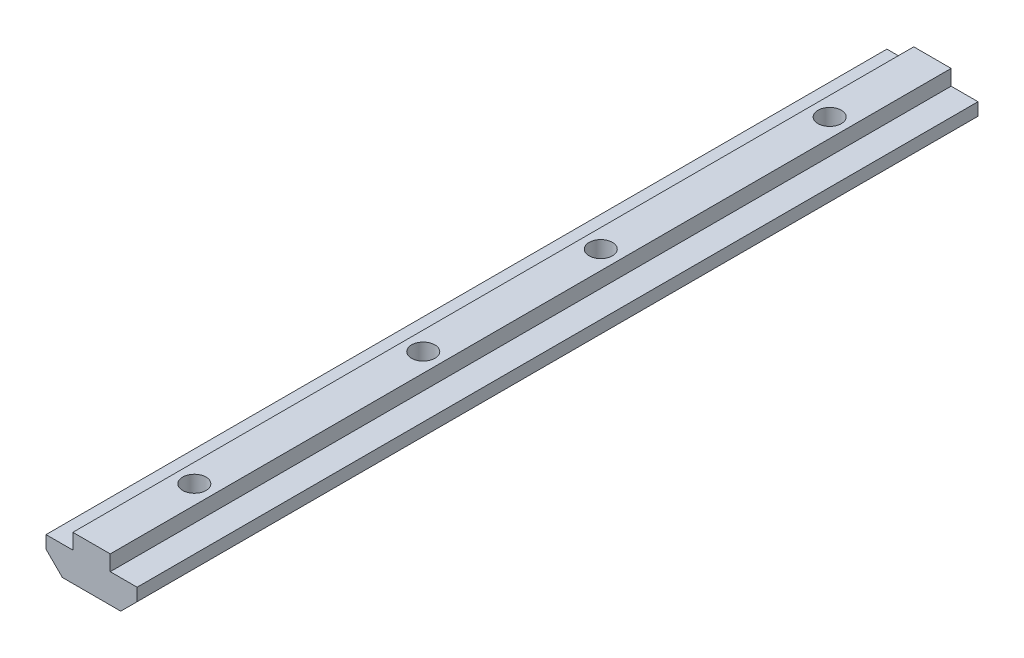
ISO-10303-21;
HEADER;
FILE_DESCRIPTION(('STEP AP214'),'2;1');
FILE_NAME('part.step','',(''),(''),'','','');
FILE_SCHEMA(('AUTOMOTIVE_DESIGN { 1 0 10303 214 1 1 1 1 }'));
ENDSEC;
DATA;
#1=APPLICATION_CONTEXT('core data for automotive mechanical design processes');
#2=APPLICATION_PROTOCOL_DEFINITION('international standard','automotive_design',2000,#1);
#3=PRODUCT_CONTEXT('',#1,'mechanical');
#4=PRODUCT('Part','Part','',(#3));
#5=PRODUCT_RELATED_PRODUCT_CATEGORY('part','',(#4));
#6=PRODUCT_DEFINITION_FORMATION('','',#4);
#7=PRODUCT_DEFINITION_CONTEXT('part definition',#1,'design');
#8=PRODUCT_DEFINITION('design','',#6,#7);
#9=PRODUCT_DEFINITION_SHAPE('','',#8);
#10=(LENGTH_UNIT() NAMED_UNIT(*) SI_UNIT(.MILLI.,.METRE.));
#11=(NAMED_UNIT(*) PLANE_ANGLE_UNIT() SI_UNIT($,.RADIAN.));
#12=(NAMED_UNIT(*) SI_UNIT($,.STERADIAN.) SOLID_ANGLE_UNIT());
#13=UNCERTAINTY_MEASURE_WITH_UNIT(LENGTH_MEASURE(1.E-05),#10,'distance_accuracy_value','');
#14=(GEOMETRIC_REPRESENTATION_CONTEXT(3) GLOBAL_UNCERTAINTY_ASSIGNED_CONTEXT((#13)) GLOBAL_UNIT_ASSIGNED_CONTEXT((#10,
#11,#12)) REPRESENTATION_CONTEXT('',''));
#15=CARTESIAN_POINT('',(0.,0.,0.));
#16=DIRECTION('',(0.,0.,1.));
#17=DIRECTION('',(1.,0.,0.));
#18=AXIS2_PLACEMENT_3D('',#15,#16,#17);
#19=CARTESIAN_POINT('',(12.5000000000002,-4.54497550705923E-13,180.));
#20=DIRECTION('',(-0.707106781186547,0.707106781186547,0.));
#21=DIRECTION('',(-0.707106781186548,-0.707106781186548,0.));
#22=AXIS2_PLACEMENT_3D('',#19,#20,#21);
#23=PLANE('',#22);
#24=DIRECTION('',(0.707106781186548,0.707106781186548,0.));
#25=VECTOR('',#24,1.);
#26=CARTESIAN_POINT('',(12.5000000000002,-4.54497550705923E-13,0.));
#27=LINE('',#26,#25);
#28=CARTESIAN_POINT('',(12.5000000000002,-4.54497550705923E-13,0.));
#29=VERTEX_POINT('',#28);
#30=CARTESIAN_POINT('',(16.0000000000005,3.49999999999977,0.));
#31=VERTEX_POINT('',#30);
#32=EDGE_CURVE('E147',#29,#31,#27,.T.);
#33=ORIENTED_EDGE('',*,*,#32,.T.);
#34=DIRECTION('',(0.,0.,-1.));
#35=VECTOR('',#34,1.);
#36=CARTESIAN_POINT('',(16.0000000000005,3.49999999999977,180.));
#37=LINE('',#36,#35);
#38=CARTESIAN_POINT('',(16.0000000000005,3.49999999999977,180.));
#39=VERTEX_POINT('',#38);
#40=EDGE_CURVE('E11',#39,#31,#37,.T.);
#41=ORIENTED_EDGE('',*,*,#40,.F.);
#42=DIRECTION('',(0.707106781186548,0.707106781186548,0.));
#43=VECTOR('',#42,1.);
#44=CARTESIAN_POINT('',(12.5000000000002,-4.54497550705923E-13,180.));
#45=LINE('',#44,#43);
#46=CARTESIAN_POINT('',(12.5000000000002,-4.54497550705923E-13,180.));
#47=VERTEX_POINT('',#46);
#48=EDGE_CURVE('E166',#47,#39,#45,.T.);
#49=ORIENTED_EDGE('',*,*,#48,.F.);
#50=DIRECTION('',(0.,0.,-1.));
#51=VECTOR('',#50,1.);
#52=CARTESIAN_POINT('',(12.5000000000002,-4.54497550705923E-13,180.));
#53=LINE('',#52,#51);
#54=EDGE_CURVE('E143',#47,#29,#53,.T.);
#55=ORIENTED_EDGE('',*,*,#54,.T.);
#56=EDGE_LOOP('',(#33,#41,#49,#55));
#57=FACE_BOUND('',#56,.T.);
#58=ADVANCED_FACE('F37',(#57),#23,.F.);
#59=CARTESIAN_POINT('',(16.0000000000005,3.49999999999977,180.));
#60=DIRECTION('',(-1.,0.,0.));
#61=DIRECTION('',(0.,-1.,0.));
#62=AXIS2_PLACEMENT_3D('',#59,#60,#61);
#63=PLANE('',#62);
#64=DIRECTION('',(0.,1.,0.));
#65=VECTOR('',#64,1.);
#66=CARTESIAN_POINT('',(16.0000000000005,3.49999999999977,0.));
#67=LINE('',#66,#65);
#68=CARTESIAN_POINT('',(16.0000000000002,6.19999999999982,0.));
#69=VERTEX_POINT('',#68);
#70=EDGE_CURVE('E150',#31,#69,#67,.T.);
#71=ORIENTED_EDGE('',*,*,#70,.T.);
#72=DIRECTION('',(0.,0.,-1.));
#73=VECTOR('',#72,1.);
#74=CARTESIAN_POINT('',(16.0000000000002,6.19999999999982,180.));
#75=LINE('',#74,#73);
#76=CARTESIAN_POINT('',(16.0000000000002,6.19999999999982,180.));
#77=VERTEX_POINT('',#76);
#78=EDGE_CURVE('E46',#77,#69,#75,.T.);
#79=ORIENTED_EDGE('',*,*,#78,.F.);
#80=DIRECTION('',(0.,1.,0.));
#81=VECTOR('',#80,1.);
#82=CARTESIAN_POINT('',(16.0000000000005,3.49999999999977,180.));
#83=LINE('',#82,#81);
#84=EDGE_CURVE('E104',#39,#77,#83,.T.);
#85=ORIENTED_EDGE('',*,*,#84,.F.);
#86=ORIENTED_EDGE('',*,*,#40,.T.);
#87=EDGE_LOOP('',(#71,#79,#85,#86));
#88=FACE_BOUND('',#87,.T.);
#89=ADVANCED_FACE('F242',(#88),#63,.F.);
#90=CARTESIAN_POINT('',(16.0000000000002,6.19999999999982,180.));
#91=DIRECTION('',(0.,-1.,0.));
#92=DIRECTION('',(1.,0.,0.));
#93=AXIS2_PLACEMENT_3D('',#90,#91,#92);
#94=PLANE('',#93);
#95=DIRECTION('',(-1.,0.,0.));
#96=VECTOR('',#95,1.);
#97=CARTESIAN_POINT('',(16.0000000000002,6.19999999999982,0.));
#98=LINE('',#97,#96);
#99=CARTESIAN_POINT('',(10.2500000000002,6.20000000000005,0.));
#100=VERTEX_POINT('',#99);
#101=EDGE_CURVE('E153',#69,#100,#98,.T.);
#102=ORIENTED_EDGE('',*,*,#101,.T.);
#103=DIRECTION('',(0.,0.,-1.));
#104=VECTOR('',#103,1.);
#105=CARTESIAN_POINT('',(10.2500000000002,6.20000000000005,180.));
#106=LINE('',#105,#104);
#107=CARTESIAN_POINT('',(10.2500000000002,6.20000000000005,180.));
#108=VERTEX_POINT('',#107);
#109=EDGE_CURVE('E179',#108,#100,#106,.T.);
#110=ORIENTED_EDGE('',*,*,#109,.F.);
#111=DIRECTION('',(-1.,0.,0.));
#112=VECTOR('',#111,1.);
#113=CARTESIAN_POINT('',(16.0000000000002,6.19999999999982,180.));
#114=LINE('',#113,#112);
#115=EDGE_CURVE('E204',#77,#108,#114,.T.);
#116=ORIENTED_EDGE('',*,*,#115,.F.);
#117=ORIENTED_EDGE('',*,*,#78,.T.);
#118=EDGE_LOOP('',(#102,#110,#116,#117));
#119=FACE_BOUND('',#118,.T.);
#120=ADVANCED_FACE('F246',(#119),#94,.F.);
#121=CARTESIAN_POINT('',(10.2500000000002,9.49999999999977,180.));
#122=DIRECTION('',(-1.,0.,0.));
#123=DIRECTION('',(0.,0.,1.));
#124=AXIS2_PLACEMENT_3D('',#121,#122,#123);
#125=PLANE('',#124);
#126=DIRECTION('',(0.,1.,0.));
#127=VECTOR('',#126,1.);
#128=CARTESIAN_POINT('',(10.2500000000002,9.49999999999977,0.));
#129=LINE('',#128,#127);
#130=CARTESIAN_POINT('',(10.2500000000002,9.49999999999977,0.));
#131=VERTEX_POINT('',#130);
#132=EDGE_CURVE('E155',#100,#131,#129,.T.);
#133=ORIENTED_EDGE('',*,*,#132,.T.);
#134=DIRECTION('',(0.,0.,-1.));
#135=VECTOR('',#134,1.);
#136=CARTESIAN_POINT('',(10.2500000000002,9.49999999999977,180.));
#137=LINE('',#136,#135);
#138=CARTESIAN_POINT('',(10.2500000000002,9.49999999999977,180.));
#139=VERTEX_POINT('',#138);
#140=EDGE_CURVE('E176',#139,#131,#137,.T.);
#141=ORIENTED_EDGE('',*,*,#140,.F.);
#142=DIRECTION('',(0.,1.,0.));
#143=VECTOR('',#142,1.);
#144=CARTESIAN_POINT('',(10.2500000000002,9.49999999999977,180.));
#145=LINE('',#144,#143);
#146=EDGE_CURVE('E206',#108,#139,#145,.T.);
#147=ORIENTED_EDGE('',*,*,#146,.F.);
#148=ORIENTED_EDGE('',*,*,#109,.T.);
#149=EDGE_LOOP('',(#133,#141,#147,#148));
#150=FACE_BOUND('',#149,.T.);
#151=ADVANCED_FACE('F250',(#150),#125,.F.);
#152=CARTESIAN_POINT('',(2.25000000000023,9.49999999999977,180.));
#153=DIRECTION('',(0.,-1.,0.));
#154=DIRECTION('',(0.,0.,-1.));
#155=AXIS2_PLACEMENT_3D('',#152,#153,#154);
#156=PLANE('',#155);
#157=CARTESIAN_POINT('',(6.25000000000023,9.49999999999977,158.));
#158=DIRECTION('',(0.,1.,0.));
#159=DIRECTION('',(0.,0.,1.));
#160=AXIS2_PLACEMENT_3D('',#157,#158,#159);
#161=CIRCLE('',#160,2.5);
#162=CARTESIAN_POINT('',(6.25000000000023,9.49999999999977,160.5));
#163=VERTEX_POINT('',#162);
#164=EDGE_CURVE('E353',#163,#163,#161,.T.);
#165=ORIENTED_EDGE('',*,*,#164,.F.);
#166=EDGE_LOOP('',(#165));
#167=FACE_BOUND('',#166,.T.);
#168=CARTESIAN_POINT('',(6.25000000000023,9.49999999999977,109.));
#169=DIRECTION('',(0.,1.,0.));
#170=DIRECTION('',(0.,0.,1.));
#171=AXIS2_PLACEMENT_3D('',#168,#169,#170);
#172=CIRCLE('',#171,2.5);
#173=CARTESIAN_POINT('',(6.25000000000023,9.49999999999977,111.5));
#174=VERTEX_POINT('',#173);
#175=EDGE_CURVE('E196',#174,#174,#172,.T.);
#176=ORIENTED_EDGE('',*,*,#175,.F.);
#177=EDGE_LOOP('',(#176));
#178=FACE_BOUND('',#177,.T.);
#179=CARTESIAN_POINT('',(6.25000000000023,9.49999999999977,22.));
#180=DIRECTION('',(0.,1.,0.));
#181=DIRECTION('',(0.,0.,1.));
#182=AXIS2_PLACEMENT_3D('',#179,#180,#181);
#183=CIRCLE('',#182,2.5);
#184=CARTESIAN_POINT('',(6.25000000000023,9.49999999999977,24.5));
#185=VERTEX_POINT('',#184);
#186=EDGE_CURVE('E186',#185,#185,#183,.T.);
#187=ORIENTED_EDGE('',*,*,#186,.F.);
#188=EDGE_LOOP('',(#187));
#189=FACE_BOUND('',#188,.T.);
#190=CARTESIAN_POINT('',(6.25000000000023,9.49999999999977,71.));
#191=DIRECTION('',(0.,1.,0.));
#192=DIRECTION('',(0.,0.,1.));
#193=AXIS2_PLACEMENT_3D('',#190,#191,#192);
#194=CIRCLE('',#193,2.5);
#195=CARTESIAN_POINT('',(6.25000000000023,9.49999999999977,73.5));
#196=VERTEX_POINT('',#195);
#197=EDGE_CURVE('E185',#196,#196,#194,.T.);
#198=ORIENTED_EDGE('',*,*,#197,.F.);
#199=EDGE_LOOP('',(#198));
#200=FACE_BOUND('',#199,.T.);
#201=DIRECTION('',(-1.,0.,0.));
#202=VECTOR('',#201,1.);
#203=CARTESIAN_POINT('',(2.25000000000023,9.49999999999977,0.));
#204=LINE('',#203,#202);
#205=CARTESIAN_POINT('',(2.25000000000023,9.49999999999977,0.));
#206=VERTEX_POINT('',#205);
#207=EDGE_CURVE('E157',#131,#206,#204,.T.);
#208=ORIENTED_EDGE('',*,*,#207,.T.);
#209=DIRECTION('',(0.,0.,-1.));
#210=VECTOR('',#209,1.);
#211=CARTESIAN_POINT('',(2.25000000000023,9.49999999999977,180.));
#212=LINE('',#211,#210);
#213=CARTESIAN_POINT('',(2.25000000000023,9.49999999999977,180.));
#214=VERTEX_POINT('',#213);
#215=EDGE_CURVE('E173',#214,#206,#212,.T.);
#216=ORIENTED_EDGE('',*,*,#215,.F.);
#217=DIRECTION('',(-1.,0.,0.));
#218=VECTOR('',#217,1.);
#219=CARTESIAN_POINT('',(2.25000000000023,9.49999999999977,180.));
#220=LINE('',#219,#218);
#221=EDGE_CURVE('E208',#139,#214,#220,.T.);
#222=ORIENTED_EDGE('',*,*,#221,.F.);
#223=ORIENTED_EDGE('',*,*,#140,.T.);
#224=EDGE_LOOP('',(#208,#216,#222,#223));
#225=FACE_BOUND('',#224,.T.);
#226=ADVANCED_FACE('F256',(#167,#178,#189,#200,#225),#156,.F.);
#227=CARTESIAN_POINT('',(2.25000000000023,9.49999999999977,180.));
#228=DIRECTION('',(1.,0.,0.));
#229=DIRECTION('',(0.,0.,-1.));
#230=AXIS2_PLACEMENT_3D('',#227,#228,#229);
#231=PLANE('',#230);
#232=DIRECTION('',(0.,-1.,0.));
#233=VECTOR('',#232,1.);
#234=CARTESIAN_POINT('',(2.25000000000023,9.49999999999977,0.));
#235=LINE('',#234,#233);
#236=CARTESIAN_POINT('',(2.25000000000023,6.20000000000005,0.));
#237=VERTEX_POINT('',#236);
#238=EDGE_CURVE('E159',#206,#237,#235,.T.);
#239=ORIENTED_EDGE('',*,*,#238,.T.);
#240=DIRECTION('',(0.,0.,-1.));
#241=VECTOR('',#240,1.);
#242=CARTESIAN_POINT('',(2.25000000000023,6.20000000000005,180.));
#243=LINE('',#242,#241);
#244=CARTESIAN_POINT('',(2.25000000000023,6.20000000000005,180.));
#245=VERTEX_POINT('',#244);
#246=EDGE_CURVE('E170',#245,#237,#243,.T.);
#247=ORIENTED_EDGE('',*,*,#246,.F.);
#248=DIRECTION('',(0.,-1.,0.));
#249=VECTOR('',#248,1.);
#250=CARTESIAN_POINT('',(2.25000000000023,9.49999999999977,180.));
#251=LINE('',#250,#249);
#252=EDGE_CURVE('E210',#214,#245,#251,.T.);
#253=ORIENTED_EDGE('',*,*,#252,.F.);
#254=ORIENTED_EDGE('',*,*,#215,.T.);
#255=EDGE_LOOP('',(#239,#247,#253,#254));
#256=FACE_BOUND('',#255,.T.);
#257=ADVANCED_FACE('F216',(#256),#231,.F.);
#258=CARTESIAN_POINT('',(2.25000000000023,6.20000000000005,180.));
#259=DIRECTION('',(0.,-1.,0.));
#260=DIRECTION('',(1.,0.,0.));
#261=AXIS2_PLACEMENT_3D('',#258,#259,#260);
#262=PLANE('',#261);
#263=DIRECTION('',(-1.,0.,0.));
#264=VECTOR('',#263,1.);
#265=CARTESIAN_POINT('',(2.25000000000023,6.20000000000005,0.));
#266=LINE('',#265,#264);
#267=CARTESIAN_POINT('',(-3.49999999999977,6.19999999999982,0.));
#268=VERTEX_POINT('',#267);
#269=EDGE_CURVE('E161',#237,#268,#266,.T.);
#270=ORIENTED_EDGE('',*,*,#269,.T.);
#271=DIRECTION('',(0.,0.,-1.));
#272=VECTOR('',#271,1.);
#273=CARTESIAN_POINT('',(-3.49999999999977,6.19999999999982,180.));
#274=LINE('',#273,#272);
#275=CARTESIAN_POINT('',(-3.49999999999977,6.19999999999982,180.));
#276=VERTEX_POINT('',#275);
#277=EDGE_CURVE('E138',#276,#268,#274,.T.);
#278=ORIENTED_EDGE('',*,*,#277,.F.);
#279=DIRECTION('',(-1.,0.,0.));
#280=VECTOR('',#279,1.);
#281=CARTESIAN_POINT('',(2.25000000000023,6.20000000000005,180.));
#282=LINE('',#281,#280);
#283=EDGE_CURVE('E129',#245,#276,#282,.T.);
#284=ORIENTED_EDGE('',*,*,#283,.F.);
#285=ORIENTED_EDGE('',*,*,#246,.T.);
#286=EDGE_LOOP('',(#270,#278,#284,#285));
#287=FACE_BOUND('',#286,.T.);
#288=ADVANCED_FACE('F220',(#287),#262,.F.);
#289=CARTESIAN_POINT('',(-3.49999999999977,6.19999999999982,180.));
#290=DIRECTION('',(1.,0.,0.));
#291=DIRECTION('',(0.,1.,0.));
#292=AXIS2_PLACEMENT_3D('',#289,#290,#291);
#293=PLANE('',#292);
#294=DIRECTION('',(0.,-1.,0.));
#295=VECTOR('',#294,1.);
#296=CARTESIAN_POINT('',(-3.49999999999977,6.19999999999982,0.));
#297=LINE('',#296,#295);
#298=CARTESIAN_POINT('',(-3.49999999999954,3.49999999999955,0.));
#299=VERTEX_POINT('',#298);
#300=EDGE_CURVE('E137',#268,#299,#297,.T.);
#301=ORIENTED_EDGE('',*,*,#300,.T.);
#302=DIRECTION('',(0.,0.,-1.));
#303=VECTOR('',#302,1.);
#304=CARTESIAN_POINT('',(-3.49999999999954,3.49999999999955,180.));
#305=LINE('',#304,#303);
#306=CARTESIAN_POINT('',(-3.49999999999954,3.49999999999955,180.));
#307=VERTEX_POINT('',#306);
#308=EDGE_CURVE('E134',#307,#299,#305,.T.);
#309=ORIENTED_EDGE('',*,*,#308,.F.);
#310=DIRECTION('',(0.,-1.,0.));
#311=VECTOR('',#310,1.);
#312=CARTESIAN_POINT('',(-3.49999999999977,6.19999999999982,180.));
#313=LINE('',#312,#311);
#314=EDGE_CURVE('E123',#276,#307,#313,.T.);
#315=ORIENTED_EDGE('',*,*,#314,.F.);
#316=ORIENTED_EDGE('',*,*,#277,.T.);
#317=EDGE_LOOP('',(#301,#309,#315,#316));
#318=FACE_BOUND('',#317,.T.);
#319=ADVANCED_FACE('F135',(#318),#293,.F.);
#320=CARTESIAN_POINT('',(0.,0.,180.));
#321=DIRECTION('',(0.707106781186547,0.707106781186547,0.));
#322=DIRECTION('',(-0.707106781186548,0.707106781186548,0.));
#323=AXIS2_PLACEMENT_3D('',#320,#321,#322);
#324=PLANE('',#323);
#325=DIRECTION('',(0.707106781186547,-0.707106781186547,0.));
#326=VECTOR('',#325,1.);
#327=CARTESIAN_POINT('',(0.,0.,0.));
#328=LINE('',#327,#326);
#329=CARTESIAN_POINT('',(0.,0.,0.));
#330=VERTEX_POINT('',#329);
#331=EDGE_CURVE('E90',#299,#330,#328,.T.);
#332=ORIENTED_EDGE('',*,*,#331,.T.);
#333=DIRECTION('',(0.,0.,-1.));
#334=VECTOR('',#333,1.);
#335=CARTESIAN_POINT('',(0.,0.,180.));
#336=LINE('',#335,#334);
#337=CARTESIAN_POINT('',(0.,0.,180.));
#338=VERTEX_POINT('',#337);
#339=EDGE_CURVE('E139',#338,#330,#336,.T.);
#340=ORIENTED_EDGE('',*,*,#339,.F.);
#341=DIRECTION('',(0.707106781186547,-0.707106781186547,0.));
#342=VECTOR('',#341,1.);
#343=CARTESIAN_POINT('',(0.,0.,180.));
#344=LINE('',#343,#342);
#345=EDGE_CURVE('E127',#307,#338,#344,.T.);
#346=ORIENTED_EDGE('',*,*,#345,.F.);
#347=ORIENTED_EDGE('',*,*,#308,.T.);
#348=EDGE_LOOP('',(#332,#340,#346,#347));
#349=FACE_BOUND('',#348,.T.);
#350=ADVANCED_FACE('F141',(#349),#324,.F.);
#351=CARTESIAN_POINT('',(12.5000000000002,-4.54497550705923E-13,180.));
#352=DIRECTION('',(0.,1.,0.));
#353=DIRECTION('',(-1.,0.,0.));
#354=AXIS2_PLACEMENT_3D('',#351,#352,#353);
#355=PLANE('',#354);
#356=CARTESIAN_POINT('',(6.25000000000023,-2.27248775352962E-13,158.));
#357=DIRECTION('',(0.,1.,0.));
#358=DIRECTION('',(-1.,0.,0.));
#359=AXIS2_PLACEMENT_3D('',#356,#357,#358);
#360=CIRCLE('',#359,2.5);
#361=CARTESIAN_POINT('',(3.75000000000023,-1.36349265211779E-13,158.));
#362=VERTEX_POINT('',#361);
#363=EDGE_CURVE('E355',#362,#362,#360,.T.);
#364=ORIENTED_EDGE('',*,*,#363,.T.);
#365=EDGE_LOOP('',(#364));
#366=FACE_BOUND('',#365,.T.);
#367=CARTESIAN_POINT('',(6.25000000000023,-2.27248775352962E-13,109.));
#368=DIRECTION('',(0.,1.,0.));
#369=DIRECTION('',(-1.,0.,0.));
#370=AXIS2_PLACEMENT_3D('',#367,#368,#369);
#371=CIRCLE('',#370,2.5);
#372=CARTESIAN_POINT('',(3.75000000000023,-1.36349265211779E-13,109.));
#373=VERTEX_POINT('',#372);
#374=EDGE_CURVE('E40',#373,#373,#371,.T.);
#375=ORIENTED_EDGE('',*,*,#374,.T.);
#376=EDGE_LOOP('',(#375));
#377=FACE_BOUND('',#376,.T.);
#378=CARTESIAN_POINT('',(6.25000000000023,-2.27248775352962E-13,22.));
#379=DIRECTION('',(0.,1.,0.));
#380=DIRECTION('',(-1.,0.,0.));
#381=AXIS2_PLACEMENT_3D('',#378,#379,#380);
#382=CIRCLE('',#381,2.5);
#383=CARTESIAN_POINT('',(3.75000000000023,-1.36349265211779E-13,22.));
#384=VERTEX_POINT('',#383);
#385=EDGE_CURVE('E183',#384,#384,#382,.T.);
#386=ORIENTED_EDGE('',*,*,#385,.T.);
#387=EDGE_LOOP('',(#386));
#388=FACE_BOUND('',#387,.T.);
#389=CARTESIAN_POINT('',(6.25000000000023,-2.27248775352962E-13,71.));
#390=DIRECTION('',(0.,1.,0.));
#391=DIRECTION('',(-1.,0.,0.));
#392=AXIS2_PLACEMENT_3D('',#389,#390,#391);
#393=CIRCLE('',#392,2.5);
#394=CARTESIAN_POINT('',(3.75000000000023,-1.36349265211779E-13,71.));
#395=VERTEX_POINT('',#394);
#396=EDGE_CURVE('E151',#395,#395,#393,.T.);
#397=ORIENTED_EDGE('',*,*,#396,.T.);
#398=EDGE_LOOP('',(#397));
#399=FACE_BOUND('',#398,.T.);
#400=DIRECTION('',(1.,0.,0.));
#401=VECTOR('',#400,1.);
#402=CARTESIAN_POINT('',(12.5000000000002,-4.54497550705923E-13,0.));
#403=LINE('',#402,#401);
#404=EDGE_CURVE('E96',#330,#29,#403,.T.);
#405=ORIENTED_EDGE('',*,*,#404,.T.);
#406=ORIENTED_EDGE('',*,*,#54,.F.);
#407=DIRECTION('',(1.,0.,0.));
#408=VECTOR('',#407,1.);
#409=CARTESIAN_POINT('',(12.5000000000002,-4.54497550705923E-13,180.));
#410=LINE('',#409,#408);
#411=EDGE_CURVE('E55',#338,#47,#410,.T.);
#412=ORIENTED_EDGE('',*,*,#411,.F.);
#413=ORIENTED_EDGE('',*,*,#339,.T.);
#414=EDGE_LOOP('',(#405,#406,#412,#413));
#415=FACE_BOUND('',#414,.T.);
#416=ADVANCED_FACE('F228',(#366,#377,#388,#399,#415),#355,.F.);
#417=CARTESIAN_POINT('',(0.,0.,180.));
#418=DIRECTION('',(0.,0.,1.));
#419=DIRECTION('',(1.,0.,0.));
#420=AXIS2_PLACEMENT_3D('',#417,#418,#419);
#421=PLANE('',#420);
#422=ORIENTED_EDGE('',*,*,#48,.T.);
#423=ORIENTED_EDGE('',*,*,#84,.T.);
#424=ORIENTED_EDGE('',*,*,#115,.T.);
#425=ORIENTED_EDGE('',*,*,#146,.T.);
#426=ORIENTED_EDGE('',*,*,#221,.T.);
#427=ORIENTED_EDGE('',*,*,#252,.T.);
#428=ORIENTED_EDGE('',*,*,#283,.T.);
#429=ORIENTED_EDGE('',*,*,#314,.T.);
#430=ORIENTED_EDGE('',*,*,#345,.T.);
#431=ORIENTED_EDGE('',*,*,#411,.T.);
#432=EDGE_LOOP('',(#422,#423,#424,#425,#426,#427,#428,#429,#430,#431));
#433=FACE_BOUND('',#432,.T.);
#434=ADVANCED_FACE('F125',(#433),#421,.T.);
#435=CARTESIAN_POINT('',(0.,0.,0.));
#436=DIRECTION('',(0.,0.,1.));
#437=DIRECTION('',(1.,0.,0.));
#438=AXIS2_PLACEMENT_3D('',#435,#436,#437);
#439=PLANE('',#438);
#440=ORIENTED_EDGE('',*,*,#32,.F.);
#441=ORIENTED_EDGE('',*,*,#404,.F.);
#442=ORIENTED_EDGE('',*,*,#331,.F.);
#443=ORIENTED_EDGE('',*,*,#300,.F.);
#444=ORIENTED_EDGE('',*,*,#269,.F.);
#445=ORIENTED_EDGE('',*,*,#238,.F.);
#446=ORIENTED_EDGE('',*,*,#207,.F.);
#447=ORIENTED_EDGE('',*,*,#132,.F.);
#448=ORIENTED_EDGE('',*,*,#101,.F.);
#449=ORIENTED_EDGE('',*,*,#70,.F.);
#450=EDGE_LOOP('',(#440,#441,#442,#443,#444,#445,#446,#447,#448,#449));
#451=FACE_BOUND('',#450,.T.);
#452=ADVANCED_FACE('F223',(#451),#439,.F.);
#453=CARTESIAN_POINT('',(6.25000000000023,9.49999999999977,71.));
#454=DIRECTION('',(0.,1.,0.));
#455=DIRECTION('',(0.,0.,1.));
#456=AXIS2_PLACEMENT_3D('',#453,#454,#455);
#457=CYLINDRICAL_SURFACE('',#456,2.5);
#458=ORIENTED_EDGE('',*,*,#197,.T.);
#459=EDGE_LOOP('',(#458));
#460=FACE_BOUND('',#459,.T.);
#461=ORIENTED_EDGE('',*,*,#396,.F.);
#462=EDGE_LOOP('',(#461));
#463=FACE_BOUND('',#462,.T.);
#464=ADVANCED_FACE('F290',(#460,#463),#457,.F.);
#465=CARTESIAN_POINT('',(6.25000000000023,9.49999999999977,22.));
#466=DIRECTION('',(0.,1.,0.));
#467=DIRECTION('',(0.,0.,1.));
#468=AXIS2_PLACEMENT_3D('',#465,#466,#467);
#469=CYLINDRICAL_SURFACE('',#468,2.5);
#470=ORIENTED_EDGE('',*,*,#186,.T.);
#471=EDGE_LOOP('',(#470));
#472=FACE_BOUND('',#471,.T.);
#473=ORIENTED_EDGE('',*,*,#385,.F.);
#474=EDGE_LOOP('',(#473));
#475=FACE_BOUND('',#474,.T.);
#476=ADVANCED_FACE('F310',(#472,#475),#469,.F.);
#477=CARTESIAN_POINT('',(6.25000000000023,9.49999999999977,109.));
#478=DIRECTION('',(0.,1.,0.));
#479=DIRECTION('',(0.,0.,1.));
#480=AXIS2_PLACEMENT_3D('',#477,#478,#479);
#481=CYLINDRICAL_SURFACE('',#480,2.5);
#482=ORIENTED_EDGE('',*,*,#175,.T.);
#483=EDGE_LOOP('',(#482));
#484=FACE_BOUND('',#483,.T.);
#485=ORIENTED_EDGE('',*,*,#374,.F.);
#486=EDGE_LOOP('',(#485));
#487=FACE_BOUND('',#486,.T.);
#488=ADVANCED_FACE('F321',(#484,#487),#481,.F.);
#489=CARTESIAN_POINT('',(6.25000000000023,9.49999999999977,158.));
#490=DIRECTION('',(0.,1.,0.));
#491=DIRECTION('',(0.,0.,1.));
#492=AXIS2_PLACEMENT_3D('',#489,#490,#491);
#493=CYLINDRICAL_SURFACE('',#492,2.5);
#494=ORIENTED_EDGE('',*,*,#164,.T.);
#495=EDGE_LOOP('',(#494));
#496=FACE_BOUND('',#495,.T.);
#497=ORIENTED_EDGE('',*,*,#363,.F.);
#498=EDGE_LOOP('',(#497));
#499=FACE_BOUND('',#498,.T.);
#500=ADVANCED_FACE('F331',(#496,#499),#493,.F.);
#501=CLOSED_SHELL('',(#58,#89,#120,#151,#226,#257,#288,#319,#350,#416,#434,#452,#464,#476,#488,#500));
#502=MANIFOLD_SOLID_BREP('B2',#501);
#503=ADVANCED_BREP_SHAPE_REPRESENTATION('',(#18,#502),#14);
#504=SHAPE_DEFINITION_REPRESENTATION(#9,#503);
ENDSEC;
END-ISO-10303-21;
